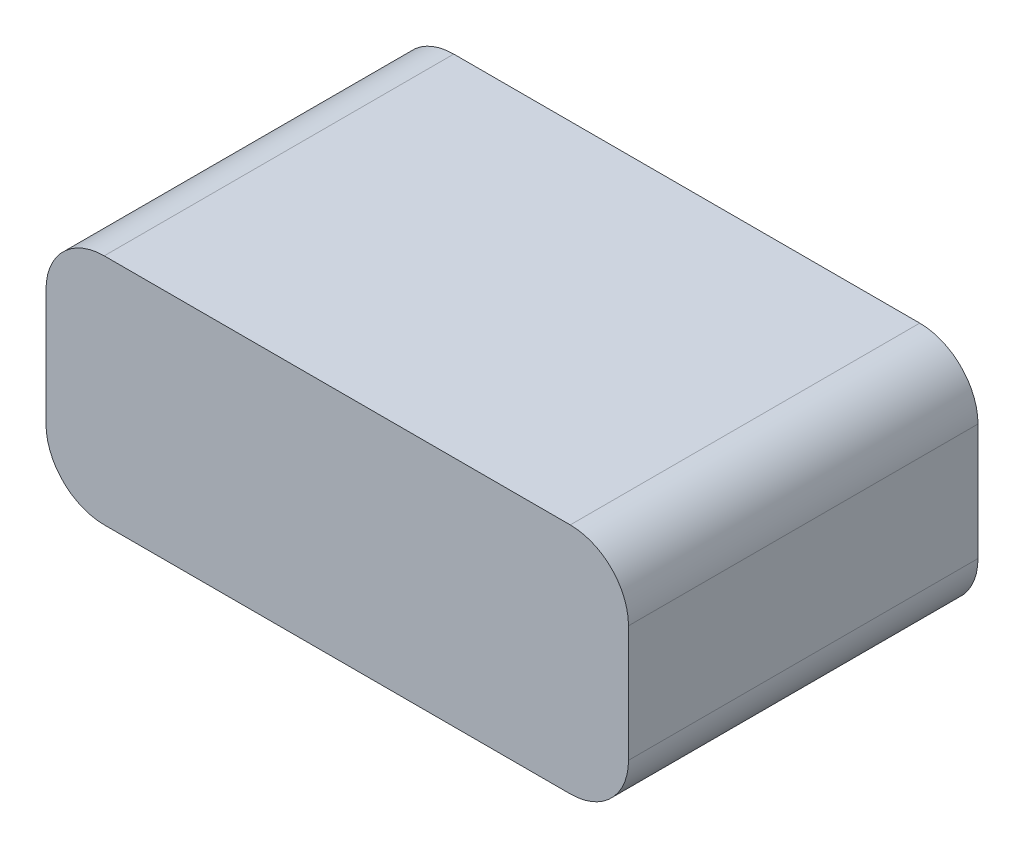
ISO-10303-21;
HEADER;
FILE_DESCRIPTION(('STEP AP214'),'2;1');
FILE_NAME('part.step','',(''),(''),'','','');
FILE_SCHEMA(('AUTOMOTIVE_DESIGN { 1 0 10303 214 1 1 1 1 }'));
ENDSEC;
DATA;
#1=APPLICATION_CONTEXT('core data for automotive mechanical design processes');
#2=APPLICATION_PROTOCOL_DEFINITION('international standard','automotive_design',2000,#1);
#3=PRODUCT_CONTEXT('',#1,'mechanical');
#4=PRODUCT('Part','Part','',(#3));
#5=PRODUCT_RELATED_PRODUCT_CATEGORY('part','',(#4));
#6=PRODUCT_DEFINITION_FORMATION('','',#4);
#7=PRODUCT_DEFINITION_CONTEXT('part definition',#1,'design');
#8=PRODUCT_DEFINITION('design','',#6,#7);
#9=PRODUCT_DEFINITION_SHAPE('','',#8);
#10=(LENGTH_UNIT() NAMED_UNIT(*) SI_UNIT(.MILLI.,.METRE.));
#11=(NAMED_UNIT(*) PLANE_ANGLE_UNIT() SI_UNIT($,.RADIAN.));
#12=(NAMED_UNIT(*) SI_UNIT($,.STERADIAN.) SOLID_ANGLE_UNIT());
#13=UNCERTAINTY_MEASURE_WITH_UNIT(LENGTH_MEASURE(1.E-05),#10,'distance_accuracy_value','');
#14=(GEOMETRIC_REPRESENTATION_CONTEXT(3) GLOBAL_UNCERTAINTY_ASSIGNED_CONTEXT((#13)) GLOBAL_UNIT_ASSIGNED_CONTEXT((#10,
#11,#12)) REPRESENTATION_CONTEXT('',''));
#15=CARTESIAN_POINT('',(0.,0.,0.));
#16=DIRECTION('',(0.,0.,1.));
#17=DIRECTION('',(1.,0.,0.));
#18=AXIS2_PLACEMENT_3D('',#15,#16,#17);
#19=CARTESIAN_POINT('',(-5.,2.,6.));
#20=DIRECTION('',(1.,0.,0.));
#21=DIRECTION('',(0.,0.,-1.));
#22=AXIS2_PLACEMENT_3D('',#19,#20,#21);
#23=PLANE('',#22);
#24=DIRECTION('',(0.,-1.,0.));
#25=VECTOR('',#24,1.);
#26=CARTESIAN_POINT('',(-5.,2.,0.));
#27=LINE('',#26,#25);
#28=CARTESIAN_POINT('',(-5.,1.,0.));
#29=VERTEX_POINT('',#28);
#30=CARTESIAN_POINT('',(-5.,-1.,0.));
#31=VERTEX_POINT('',#30);
#32=EDGE_CURVE('E127',#29,#31,#27,.T.);
#33=ORIENTED_EDGE('',*,*,#32,.T.);
#34=DIRECTION('',(0.,0.,-1.));
#35=VECTOR('',#34,1.);
#36=CARTESIAN_POINT('',(-5.,-1.,6.));
#37=LINE('',#36,#35);
#38=CARTESIAN_POINT('',(-5.,-1.,6.));
#39=VERTEX_POINT('',#38);
#40=EDGE_CURVE('E104',#31,#39,#37,.F.);
#41=ORIENTED_EDGE('',*,*,#40,.T.);
#42=DIRECTION('',(0.,-1.,0.));
#43=VECTOR('',#42,1.);
#44=CARTESIAN_POINT('',(-5.,2.,6.));
#45=LINE('',#44,#43);
#46=CARTESIAN_POINT('',(-5.,1.,6.));
#47=VERTEX_POINT('',#46);
#48=EDGE_CURVE('E136',#47,#39,#45,.T.);
#49=ORIENTED_EDGE('',*,*,#48,.F.);
#50=DIRECTION('',(0.,0.,-1.));
#51=VECTOR('',#50,1.);
#52=CARTESIAN_POINT('',(-5.,1.,6.));
#53=LINE('',#52,#51);
#54=EDGE_CURVE('E109',#47,#29,#53,.T.);
#55=ORIENTED_EDGE('',*,*,#54,.T.);
#56=EDGE_LOOP('',(#33,#41,#49,#55));
#57=FACE_BOUND('',#56,.T.);
#58=ADVANCED_FACE('F32',(#57),#23,.F.);
#59=CARTESIAN_POINT('',(-5.,-2.,6.));
#60=DIRECTION('',(0.,1.,0.));
#61=DIRECTION('',(0.,0.,1.));
#62=AXIS2_PLACEMENT_3D('',#59,#60,#61);
#63=PLANE('',#62);
#64=DIRECTION('',(1.,0.,0.));
#65=VECTOR('',#64,1.);
#66=CARTESIAN_POINT('',(-5.,-2.,6.));
#67=LINE('',#66,#65);
#68=CARTESIAN_POINT('',(-4.,-2.,6.));
#69=VERTEX_POINT('',#68);
#70=CARTESIAN_POINT('',(4.,-2.,6.));
#71=VERTEX_POINT('',#70);
#72=EDGE_CURVE('E119',#69,#71,#67,.T.);
#73=ORIENTED_EDGE('',*,*,#72,.F.);
#74=DIRECTION('',(0.,0.,-1.));
#75=VECTOR('',#74,1.);
#76=CARTESIAN_POINT('',(-4.,-2.,6.));
#77=LINE('',#76,#75);
#78=CARTESIAN_POINT('',(-4.,-2.,0.));
#79=VERTEX_POINT('',#78);
#80=EDGE_CURVE('E103',#69,#79,#77,.T.);
#81=ORIENTED_EDGE('',*,*,#80,.T.);
#82=DIRECTION('',(1.,0.,0.));
#83=VECTOR('',#82,1.);
#84=CARTESIAN_POINT('',(-5.,-2.,0.));
#85=LINE('',#84,#83);
#86=CARTESIAN_POINT('',(4.,-2.,0.));
#87=VERTEX_POINT('',#86);
#88=EDGE_CURVE('E116',#79,#87,#85,.T.);
#89=ORIENTED_EDGE('',*,*,#88,.T.);
#90=DIRECTION('',(0.,0.,-1.));
#91=VECTOR('',#90,1.);
#92=CARTESIAN_POINT('',(4.,-2.,6.));
#93=LINE('',#92,#91);
#94=EDGE_CURVE('E121',#87,#71,#93,.F.);
#95=ORIENTED_EDGE('',*,*,#94,.T.);
#96=EDGE_LOOP('',(#73,#81,#89,#95));
#97=FACE_BOUND('',#96,.T.);
#98=ADVANCED_FACE('F115',(#97),#63,.F.);
#99=CARTESIAN_POINT('',(5.,2.,6.));
#100=DIRECTION('',(-1.,0.,0.));
#101=DIRECTION('',(0.,0.,1.));
#102=AXIS2_PLACEMENT_3D('',#99,#100,#101);
#103=PLANE('',#102);
#104=DIRECTION('',(0.,1.,0.));
#105=VECTOR('',#104,1.);
#106=CARTESIAN_POINT('',(5.,2.,6.));
#107=LINE('',#106,#105);
#108=CARTESIAN_POINT('',(5.,-1.,6.));
#109=VERTEX_POINT('',#108);
#110=CARTESIAN_POINT('',(5.,1.,6.));
#111=VERTEX_POINT('',#110);
#112=EDGE_CURVE('E159',#109,#111,#107,.T.);
#113=ORIENTED_EDGE('',*,*,#112,.F.);
#114=DIRECTION('',(0.,0.,-1.));
#115=VECTOR('',#114,1.);
#116=CARTESIAN_POINT('',(5.,-1.,6.));
#117=LINE('',#116,#115);
#118=CARTESIAN_POINT('',(5.,-1.,0.));
#119=VERTEX_POINT('',#118);
#120=EDGE_CURVE('E11',#109,#119,#117,.T.);
#121=ORIENTED_EDGE('',*,*,#120,.T.);
#122=DIRECTION('',(0.,1.,0.));
#123=VECTOR('',#122,1.);
#124=CARTESIAN_POINT('',(5.,2.,0.));
#125=LINE('',#124,#123);
#126=CARTESIAN_POINT('',(5.,1.,0.));
#127=VERTEX_POINT('',#126);
#128=EDGE_CURVE('E126',#119,#127,#125,.T.);
#129=ORIENTED_EDGE('',*,*,#128,.T.);
#130=DIRECTION('',(0.,0.,-1.));
#131=VECTOR('',#130,1.);
#132=CARTESIAN_POINT('',(5.,1.,6.));
#133=LINE('',#132,#131);
#134=EDGE_CURVE('E40',#127,#111,#133,.F.);
#135=ORIENTED_EDGE('',*,*,#134,.T.);
#136=EDGE_LOOP('',(#113,#121,#129,#135));
#137=FACE_BOUND('',#136,.T.);
#138=ADVANCED_FACE('F158',(#137),#103,.F.);
#139=CARTESIAN_POINT('',(-5.,2.,6.));
#140=DIRECTION('',(0.,-1.,0.));
#141=DIRECTION('',(0.,0.,-1.));
#142=AXIS2_PLACEMENT_3D('',#139,#140,#141);
#143=PLANE('',#142);
#144=DIRECTION('',(-1.,0.,0.));
#145=VECTOR('',#144,1.);
#146=CARTESIAN_POINT('',(-5.,2.,0.));
#147=LINE('',#146,#145);
#148=CARTESIAN_POINT('',(4.,2.,0.));
#149=VERTEX_POINT('',#148);
#150=CARTESIAN_POINT('',(-4.,2.,0.));
#151=VERTEX_POINT('',#150);
#152=EDGE_CURVE('E130',#149,#151,#147,.T.);
#153=ORIENTED_EDGE('',*,*,#152,.T.);
#154=DIRECTION('',(0.,0.,-1.));
#155=VECTOR('',#154,1.);
#156=CARTESIAN_POINT('',(-4.,2.,6.));
#157=LINE('',#156,#155);
#158=CARTESIAN_POINT('',(-4.,2.,6.));
#159=VERTEX_POINT('',#158);
#160=EDGE_CURVE('E47',#151,#159,#157,.F.);
#161=ORIENTED_EDGE('',*,*,#160,.T.);
#162=DIRECTION('',(-1.,0.,0.));
#163=VECTOR('',#162,1.);
#164=CARTESIAN_POINT('',(-5.,2.,6.));
#165=LINE('',#164,#163);
#166=CARTESIAN_POINT('',(4.,2.,6.));
#167=VERTEX_POINT('',#166);
#168=EDGE_CURVE('E137',#167,#159,#165,.T.);
#169=ORIENTED_EDGE('',*,*,#168,.F.);
#170=DIRECTION('',(0.,0.,-1.));
#171=VECTOR('',#170,1.);
#172=CARTESIAN_POINT('',(4.,2.,6.));
#173=LINE('',#172,#171);
#174=EDGE_CURVE('E152',#167,#149,#173,.T.);
#175=ORIENTED_EDGE('',*,*,#174,.T.);
#176=EDGE_LOOP('',(#153,#161,#169,#175));
#177=FACE_BOUND('',#176,.T.);
#178=ADVANCED_FACE('F168',(#177),#143,.F.);
#179=CARTESIAN_POINT('',(0.,0.,6.));
#180=DIRECTION('',(0.,0.,1.));
#181=DIRECTION('',(1.,0.,0.));
#182=AXIS2_PLACEMENT_3D('',#179,#180,#181);
#183=PLANE('',#182);
#184=ORIENTED_EDGE('',*,*,#48,.T.);
#185=CARTESIAN_POINT('',(-4.,-1.,6.));
#186=DIRECTION('',(0.,0.,1.));
#187=DIRECTION('',(1.,0.,0.));
#188=AXIS2_PLACEMENT_3D('',#185,#186,#187);
#189=CIRCLE('',#188,1.);
#190=EDGE_CURVE('E150',#39,#69,#189,.T.);
#191=ORIENTED_EDGE('',*,*,#190,.T.);
#192=ORIENTED_EDGE('',*,*,#72,.T.);
#193=CARTESIAN_POINT('',(4.,-1.,6.));
#194=DIRECTION('',(0.,0.,1.));
#195=DIRECTION('',(1.,0.,0.));
#196=AXIS2_PLACEMENT_3D('',#193,#194,#195);
#197=CIRCLE('',#196,1.);
#198=EDGE_CURVE('E146',#71,#109,#197,.T.);
#199=ORIENTED_EDGE('',*,*,#198,.T.);
#200=ORIENTED_EDGE('',*,*,#112,.T.);
#201=CARTESIAN_POINT('',(4.,1.,6.));
#202=DIRECTION('',(0.,0.,1.));
#203=DIRECTION('',(1.,0.,0.));
#204=AXIS2_PLACEMENT_3D('',#201,#202,#203);
#205=CIRCLE('',#204,1.);
#206=EDGE_CURVE('E54',#111,#167,#205,.T.);
#207=ORIENTED_EDGE('',*,*,#206,.T.);
#208=ORIENTED_EDGE('',*,*,#168,.T.);
#209=CARTESIAN_POINT('',(-4.,1.,6.));
#210=DIRECTION('',(0.,0.,1.));
#211=DIRECTION('',(1.,0.,0.));
#212=AXIS2_PLACEMENT_3D('',#209,#210,#211);
#213=CIRCLE('',#212,1.);
#214=EDGE_CURVE('E148',#159,#47,#213,.T.);
#215=ORIENTED_EDGE('',*,*,#214,.T.);
#216=EDGE_LOOP('',(#184,#191,#192,#199,#200,#207,#208,#215));
#217=FACE_BOUND('',#216,.T.);
#218=ADVANCED_FACE('F163',(#217),#183,.T.);
#219=CARTESIAN_POINT('',(0.,0.,0.));
#220=DIRECTION('',(0.,0.,1.));
#221=DIRECTION('',(1.,0.,0.));
#222=AXIS2_PLACEMENT_3D('',#219,#220,#221);
#223=PLANE('',#222);
#224=ORIENTED_EDGE('',*,*,#88,.F.);
#225=CARTESIAN_POINT('',(-4.,-1.,0.));
#226=DIRECTION('',(0.,0.,1.));
#227=DIRECTION('',(1.,0.,0.));
#228=AXIS2_PLACEMENT_3D('',#225,#226,#227);
#229=CIRCLE('',#228,1.);
#230=EDGE_CURVE('E99',#79,#31,#229,.F.);
#231=ORIENTED_EDGE('',*,*,#230,.T.);
#232=ORIENTED_EDGE('',*,*,#32,.F.);
#233=CARTESIAN_POINT('',(-4.,1.,0.));
#234=DIRECTION('',(0.,0.,1.));
#235=DIRECTION('',(1.,0.,0.));
#236=AXIS2_PLACEMENT_3D('',#233,#234,#235);
#237=CIRCLE('',#236,1.);
#238=EDGE_CURVE('E110',#29,#151,#237,.F.);
#239=ORIENTED_EDGE('',*,*,#238,.T.);
#240=ORIENTED_EDGE('',*,*,#152,.F.);
#241=CARTESIAN_POINT('',(4.,1.,0.));
#242=DIRECTION('',(0.,0.,1.));
#243=DIRECTION('',(1.,0.,0.));
#244=AXIS2_PLACEMENT_3D('',#241,#242,#243);
#245=CIRCLE('',#244,1.);
#246=EDGE_CURVE('E120',#149,#127,#245,.F.);
#247=ORIENTED_EDGE('',*,*,#246,.T.);
#248=ORIENTED_EDGE('',*,*,#128,.F.);
#249=CARTESIAN_POINT('',(4.,-1.,0.));
#250=DIRECTION('',(0.,0.,1.));
#251=DIRECTION('',(1.,0.,0.));
#252=AXIS2_PLACEMENT_3D('',#249,#250,#251);
#253=CIRCLE('',#252,1.);
#254=EDGE_CURVE('E125',#119,#87,#253,.F.);
#255=ORIENTED_EDGE('',*,*,#254,.T.);
#256=EDGE_LOOP('',(#224,#231,#232,#239,#240,#247,#248,#255));
#257=FACE_BOUND('',#256,.T.);
#258=ADVANCED_FACE('F123',(#257),#223,.F.);
#259=CARTESIAN_POINT('',(-4.,-1.,6.));
#260=DIRECTION('',(0.,0.,-1.));
#261=DIRECTION('',(-1.,0.,0.));
#262=AXIS2_PLACEMENT_3D('',#259,#260,#261);
#263=CYLINDRICAL_SURFACE('',#262,1.);
#264=ORIENTED_EDGE('',*,*,#190,.F.);
#265=ORIENTED_EDGE('',*,*,#40,.F.);
#266=ORIENTED_EDGE('',*,*,#230,.F.);
#267=ORIENTED_EDGE('',*,*,#80,.F.);
#268=EDGE_LOOP('',(#264,#265,#266,#267));
#269=FACE_BOUND('',#268,.T.);
#270=ADVANCED_FACE('F102',(#269),#263,.T.);
#271=CARTESIAN_POINT('',(-4.,1.,6.));
#272=DIRECTION('',(0.,0.,-1.));
#273=DIRECTION('',(-1.,0.,0.));
#274=AXIS2_PLACEMENT_3D('',#271,#272,#273);
#275=CYLINDRICAL_SURFACE('',#274,1.);
#276=ORIENTED_EDGE('',*,*,#214,.F.);
#277=ORIENTED_EDGE('',*,*,#160,.F.);
#278=ORIENTED_EDGE('',*,*,#238,.F.);
#279=ORIENTED_EDGE('',*,*,#54,.F.);
#280=EDGE_LOOP('',(#276,#277,#278,#279));
#281=FACE_BOUND('',#280,.T.);
#282=ADVANCED_FACE('F172',(#281),#275,.T.);
#283=CARTESIAN_POINT('',(4.,-1.,6.));
#284=DIRECTION('',(0.,0.,-1.));
#285=DIRECTION('',(-1.,0.,0.));
#286=AXIS2_PLACEMENT_3D('',#283,#284,#285);
#287=CYLINDRICAL_SURFACE('',#286,1.);
#288=ORIENTED_EDGE('',*,*,#198,.F.);
#289=ORIENTED_EDGE('',*,*,#94,.F.);
#290=ORIENTED_EDGE('',*,*,#254,.F.);
#291=ORIENTED_EDGE('',*,*,#120,.F.);
#292=EDGE_LOOP('',(#288,#289,#290,#291));
#293=FACE_BOUND('',#292,.T.);
#294=ADVANCED_FACE('F178',(#293),#287,.T.);
#295=CARTESIAN_POINT('',(4.,1.,6.));
#296=DIRECTION('',(0.,0.,-1.));
#297=DIRECTION('',(-1.,0.,0.));
#298=AXIS2_PLACEMENT_3D('',#295,#296,#297);
#299=CYLINDRICAL_SURFACE('',#298,1.);
#300=ORIENTED_EDGE('',*,*,#206,.F.);
#301=ORIENTED_EDGE('',*,*,#134,.F.);
#302=ORIENTED_EDGE('',*,*,#246,.F.);
#303=ORIENTED_EDGE('',*,*,#174,.F.);
#304=EDGE_LOOP('',(#300,#301,#302,#303));
#305=FACE_BOUND('',#304,.T.);
#306=ADVANCED_FACE('F34',(#305),#299,.T.);
#307=CLOSED_SHELL('',(#58,#98,#138,#178,#218,#258,#270,#282,#294,#306));
#308=MANIFOLD_SOLID_BREP('B2',#307);
#309=ADVANCED_BREP_SHAPE_REPRESENTATION('',(#18,#308),#14);
#310=SHAPE_DEFINITION_REPRESENTATION(#9,#309);
ENDSEC;
END-ISO-10303-21;
